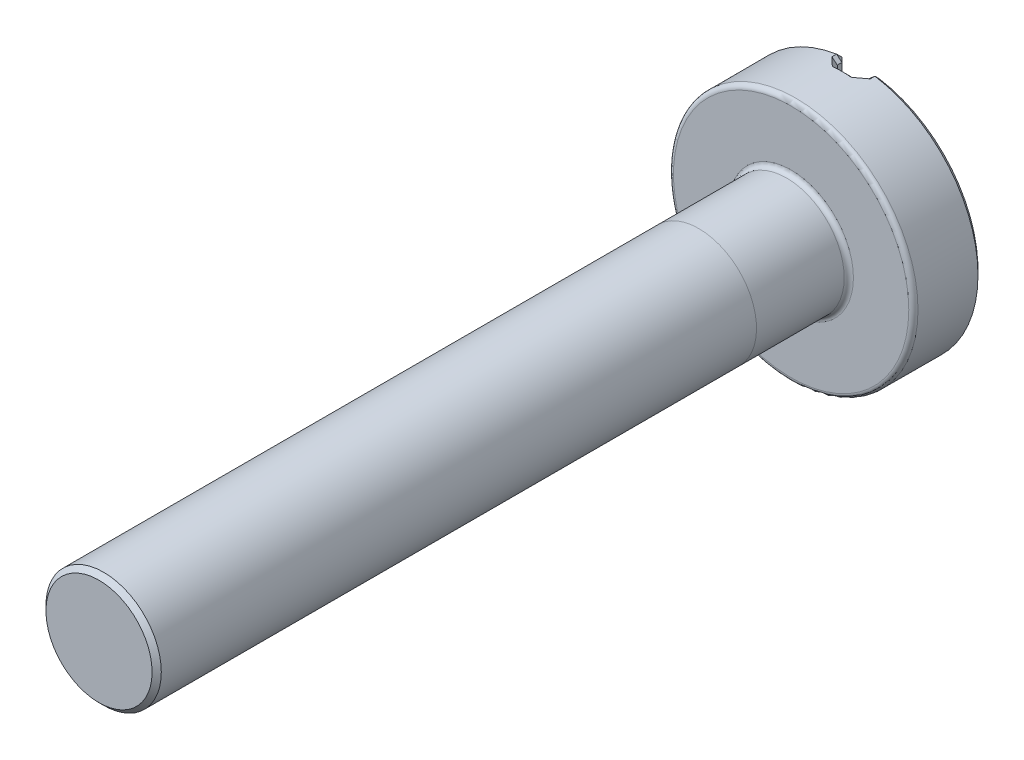
ISO-10303-21;
HEADER;
FILE_DESCRIPTION(('STEP AP214'),'2;1');
FILE_NAME('part.step','',(''),(''),'','','');
FILE_SCHEMA(('AUTOMOTIVE_DESIGN { 1 0 10303 214 1 1 1 1 }'));
ENDSEC;
DATA;
#1=APPLICATION_CONTEXT('core data for automotive mechanical design processes');
#2=APPLICATION_PROTOCOL_DEFINITION('international standard','automotive_design',2000,#1);
#3=PRODUCT_CONTEXT('',#1,'mechanical');
#4=PRODUCT('Part','Part','',(#3));
#5=PRODUCT_RELATED_PRODUCT_CATEGORY('part','',(#4));
#6=PRODUCT_DEFINITION_FORMATION('','',#4);
#7=PRODUCT_DEFINITION_CONTEXT('part definition',#1,'design');
#8=PRODUCT_DEFINITION('design','',#6,#7);
#9=PRODUCT_DEFINITION_SHAPE('','',#8);
#10=(LENGTH_UNIT() NAMED_UNIT(*) SI_UNIT(.MILLI.,.METRE.));
#11=(NAMED_UNIT(*) PLANE_ANGLE_UNIT() SI_UNIT($,.RADIAN.));
#12=(NAMED_UNIT(*) SI_UNIT($,.STERADIAN.) SOLID_ANGLE_UNIT());
#13=UNCERTAINTY_MEASURE_WITH_UNIT(LENGTH_MEASURE(1.E-05),#10,'distance_accuracy_value','');
#14=(GEOMETRIC_REPRESENTATION_CONTEXT(3) GLOBAL_UNCERTAINTY_ASSIGNED_CONTEXT((#13)) GLOBAL_UNIT_ASSIGNED_CONTEXT((#10,
#11,#12)) REPRESENTATION_CONTEXT('',''));
#15=CARTESIAN_POINT('',(0.,0.,0.));
#16=DIRECTION('',(0.,0.,1.));
#17=DIRECTION('',(1.,0.,0.));
#18=AXIS2_PLACEMENT_3D('',#15,#16,#17);
#19=CARTESIAN_POINT('',(0.,0.,7.5));
#20=DIRECTION('',(0.,0.,-1.));
#21=DIRECTION('',(-1.,0.,0.));
#22=AXIS2_PLACEMENT_3D('',#19,#20,#21);
#23=CYLINDRICAL_SURFACE('',#22,0.625);
#24=CARTESIAN_POINT('',(0.,0.,7.45));
#25=DIRECTION('',(0.,0.,1.));
#26=DIRECTION('',(1.,0.,0.));
#27=AXIS2_PLACEMENT_3D('',#24,#25,#26);
#28=CIRCLE('',#27,0.625);
#29=CARTESIAN_POINT('',(0.625,0.,7.45));
#30=VERTEX_POINT('',#29);
#31=EDGE_CURVE('E59',#30,#30,#28,.F.);
#32=ORIENTED_EDGE('',*,*,#31,.T.);
#33=EDGE_LOOP('',(#32));
#34=FACE_BOUND('',#33,.T.);
#35=CARTESIAN_POINT('',(0.,0.,1.));
#36=DIRECTION('',(0.,0.,-1.));
#37=DIRECTION('',(0.,1.,0.));
#38=AXIS2_PLACEMENT_3D('',#35,#36,#37);
#39=CIRCLE('',#38,0.625);
#40=CARTESIAN_POINT('',(0.,0.625,1.));
#41=VERTEX_POINT('',#40);
#42=EDGE_CURVE('E11',#41,#41,#39,.T.);
#43=ORIENTED_EDGE('',*,*,#42,.F.);
#44=EDGE_LOOP('',(#43));
#45=FACE_BOUND('',#44,.T.);
#46=ADVANCED_FACE('F49',(#34,#45),#23,.T.);
#47=CARTESIAN_POINT('',(0.,0.,-0.75));
#48=DIRECTION('',(0.,0.,1.));
#49=DIRECTION('',(1.,0.,0.));
#50=AXIS2_PLACEMENT_3D('',#47,#48,#49);
#51=CYLINDRICAL_SURFACE('',#50,1.325);
#52=CARTESIAN_POINT('',(0.,0.,-0.05));
#53=DIRECTION('',(0.,0.,1.));
#54=DIRECTION('',(1.,0.,0.));
#55=AXIS2_PLACEMENT_3D('',#52,#53,#54);
#56=CIRCLE('',#55,1.325);
#57=CARTESIAN_POINT('',(1.325,0.,-0.05));
#58=VERTEX_POINT('',#57);
#59=EDGE_CURVE('E539',#58,#58,#56,.F.);
#60=ORIENTED_EDGE('',*,*,#59,.T.);
#61=EDGE_LOOP('',(#60));
#62=FACE_BOUND('',#61,.T.);
#63=CARTESIAN_POINT('',(-0.207843137254903,1.30859704657165,-0.650000000000001));
#64=CARTESIAN_POINT('',(-0.198944612952266,1.31001015516288,-0.641083323710144));
#65=CARTESIAN_POINT('',(-0.189997133243153,1.3113383968159,-0.632201765348477));
#66=CARTESIAN_POINT('',(-0.171998203310304,1.31382052719629,-0.614519994761565));
#67=CARTESIAN_POINT('',(-0.162946752754306,1.3149744153663,-0.605719782796444));
#68=CARTESIAN_POINT('',(-0.137386181813813,1.31796203945144,-0.581148582652646));
#69=CARTESIAN_POINT('',(-0.120752529010109,1.31959309958516,-0.565482355604767));
#70=CARTESIAN_POINT('',(-0.103921568627449,1.32091835764895,-0.549999999999999));
#71=B_SPLINE_CURVE_WITH_KNOTS('',3,(#63,#64,#65,#66,#67,#68,#69,#70),.UNSPECIFIED.,.F.,.F.,(4,2,
2,4),(0.,0.0380286734960465,0.0760574685548907,0.144770496492939),.UNSPECIFIED.);
#72=CARTESIAN_POINT('',(-0.207843137254903,1.30859704657165,-0.650000000000001));
#73=VERTEX_POINT('',#72);
#74=CARTESIAN_POINT('',(-0.103921568627449,1.32091835764895,-0.549999999999999));
#75=VERTEX_POINT('',#74);
#76=EDGE_CURVE('E281',#73,#75,#71,.T.);
#77=ORIENTED_EDGE('',*,*,#76,.F.);
#78=DIRECTION('',(0.,0.,1.));
#79=VECTOR('',#78,1.);
#80=CARTESIAN_POINT('',(-0.207843137254903,1.30859704657165,-0.75));
#81=LINE('',#80,#79);
#82=CARTESIAN_POINT('',(-0.207843137254903,1.30859704657165,-0.699999999999998));
#83=VERTEX_POINT('',#82);
#84=EDGE_CURVE('E278',#73,#83,#81,.F.);
#85=ORIENTED_EDGE('',*,*,#84,.T.);
#86=CARTESIAN_POINT('',(0.,0.,-0.699999999999998));
#87=DIRECTION('',(0.,0.,1.));
#88=DIRECTION('',(1.,0.,0.));
#89=AXIS2_PLACEMENT_3D('',#86,#87,#88);
#90=CIRCLE('',#89,1.325);
#91=CARTESIAN_POINT('',(-0.207843137254903,-1.30859704657165,-0.699999999999998));
#92=VERTEX_POINT('',#91);
#93=EDGE_CURVE('E272',#83,#92,#90,.T.);
#94=ORIENTED_EDGE('',*,*,#93,.T.);
#95=DIRECTION('',(0.,0.,1.));
#96=VECTOR('',#95,1.);
#97=CARTESIAN_POINT('',(-0.207843137254903,-1.30859704657165,-0.75));
#98=LINE('',#97,#96);
#99=CARTESIAN_POINT('',(-0.207843137254903,-1.30859704657165,-0.650000000000001));
#100=VERTEX_POINT('',#99);
#101=EDGE_CURVE('E159',#92,#100,#98,.T.);
#102=ORIENTED_EDGE('',*,*,#101,.T.);
#103=CARTESIAN_POINT('',(-0.10392156862745,-1.32091835764895,-0.549999999999999));
#104=CARTESIAN_POINT('',(-0.113236467272082,-1.3201852676791,-0.558567275963699));
#105=CARTESIAN_POINT('',(-0.122490767260579,-1.31935825110937,-0.567191695644924));
#106=CARTESIAN_POINT('',(-0.140884473864295,-1.31752124601971,-0.584542919242578));
#107=CARTESIAN_POINT('',(-0.150023881068516,-1.3165112584382,-0.593269722633688));
#108=CARTESIAN_POINT('',(-0.17552459729029,-1.31342642300711,-0.617891690895517));
#109=CARTESIAN_POINT('',(-0.191763051988927,-1.31114990369223,-0.633889412681227));
#110=CARTESIAN_POINT('',(-0.207843137254903,-1.30859704657165,-0.650000000000001));
#111=B_SPLINE_CURVE_WITH_KNOTS('',3,(#103,#104,#105,#106,#107,#108,#109,#110),.UNSPECIFIED.,.F.,
.F.,(4,2,2,4),(0.,0.0380291626217555,0.076058130205947,0.144770913983086),.UNSPECIFIED.);
#112=CARTESIAN_POINT('',(-0.10392156862745,-1.32091835764895,-0.549999999999999));
#113=VERTEX_POINT('',#112);
#114=EDGE_CURVE('E262',#113,#100,#111,.T.);
#115=ORIENTED_EDGE('',*,*,#114,.F.);
#116=CARTESIAN_POINT('',(0.,0.,-0.549999999999999));
#117=DIRECTION('',(0.,0.,-1.));
#118=DIRECTION('',(-1.,0.,0.));
#119=AXIS2_PLACEMENT_3D('',#116,#117,#118);
#120=CIRCLE('',#119,1.325);
#121=CARTESIAN_POINT('',(0.103921568627449,-1.32091835764895,-0.549999999999999));
#122=VERTEX_POINT('',#121);
#123=EDGE_CURVE('E217',#113,#122,#120,.F.);
#124=ORIENTED_EDGE('',*,*,#123,.T.);
#125=CARTESIAN_POINT('',(0.207843137254903,-1.30859704657165,-0.650000000000001));
#126=CARTESIAN_POINT('',(0.198944612952267,-1.31001015516288,-0.641083323710144));
#127=CARTESIAN_POINT('',(0.189997133243153,-1.3113383968159,-0.632201765348477));
#128=CARTESIAN_POINT('',(0.171998203310304,-1.31382052719629,-0.614519994761565));
#129=CARTESIAN_POINT('',(0.162946752754305,-1.3149744153663,-0.605719782796444));
#130=CARTESIAN_POINT('',(0.137386181813813,-1.31796203945144,-0.581148582652646));
#131=CARTESIAN_POINT('',(0.120752529010108,-1.31959309958516,-0.565482355604768));
#132=CARTESIAN_POINT('',(0.103921568627449,-1.32091835764895,-0.549999999999999));
#133=B_SPLINE_CURVE_WITH_KNOTS('',3,(#125,#126,#127,#128,#129,#130,#131,#132),.UNSPECIFIED.,.F.,
.F.,(4,2,2,4),(0.,0.0380286734960465,0.0760574685548907,0.144770496492939),.UNSPECIFIED.);
#134=CARTESIAN_POINT('',(0.207843137254903,-1.30859704657165,-0.650000000000001));
#135=VERTEX_POINT('',#134);
#136=EDGE_CURVE('E207',#135,#122,#133,.T.);
#137=ORIENTED_EDGE('',*,*,#136,.F.);
#138=DIRECTION('',(0.,0.,1.));
#139=VECTOR('',#138,1.);
#140=CARTESIAN_POINT('',(0.207843137254903,-1.30859704657165,-0.75));
#141=LINE('',#140,#139);
#142=CARTESIAN_POINT('',(0.207843137254903,-1.30859704657165,-0.699999999999998));
#143=VERTEX_POINT('',#142);
#144=EDGE_CURVE('E204',#135,#143,#141,.F.);
#145=ORIENTED_EDGE('',*,*,#144,.T.);
#146=CARTESIAN_POINT('',(0.,0.,-0.699999999999998));
#147=DIRECTION('',(0.,0.,1.));
#148=DIRECTION('',(1.,0.,0.));
#149=AXIS2_PLACEMENT_3D('',#146,#147,#148);
#150=CIRCLE('',#149,1.325);
#151=CARTESIAN_POINT('',(0.207843137254903,1.30859704657165,-0.699999999999998));
#152=VERTEX_POINT('',#151);
#153=EDGE_CURVE('E195',#143,#152,#150,.T.);
#154=ORIENTED_EDGE('',*,*,#153,.T.);
#155=DIRECTION('',(0.,0.,1.));
#156=VECTOR('',#155,1.);
#157=CARTESIAN_POINT('',(0.207843137254903,1.30859704657165,-0.75));
#158=LINE('',#157,#156);
#159=CARTESIAN_POINT('',(0.207843137254903,1.30859704657165,-0.650000000000001));
#160=VERTEX_POINT('',#159);
#161=EDGE_CURVE('E201',#152,#160,#158,.T.);
#162=ORIENTED_EDGE('',*,*,#161,.T.);
#163=CARTESIAN_POINT('',(0.10392156862745,1.32091835764895,-0.549999999999999));
#164=CARTESIAN_POINT('',(0.113236467272082,1.3201852676791,-0.558567275963698));
#165=CARTESIAN_POINT('',(0.122490767260579,1.31935825110937,-0.567191695644924));
#166=CARTESIAN_POINT('',(0.140884473864295,1.31752124601971,-0.584542919242578));
#167=CARTESIAN_POINT('',(0.150023881068516,1.3165112584382,-0.593269722633687));
#168=CARTESIAN_POINT('',(0.17552459729029,1.31342642300711,-0.617891690895517));
#169=CARTESIAN_POINT('',(0.191763051988927,1.31114990369223,-0.633889412681227));
#170=CARTESIAN_POINT('',(0.207843137254903,1.30859704657165,-0.650000000000001));
#171=B_SPLINE_CURVE_WITH_KNOTS('',3,(#163,#164,#165,#166,#167,#168,#169,#170),.UNSPECIFIED.,.F.,
.F.,(4,2,2,4),(0.,0.0380291626217554,0.0760581302059466,0.144770913983086),.UNSPECIFIED.);
#172=CARTESIAN_POINT('',(0.10392156862745,1.32091835764895,-0.549999999999999));
#173=VERTEX_POINT('',#172);
#174=EDGE_CURVE('E254',#173,#160,#171,.T.);
#175=ORIENTED_EDGE('',*,*,#174,.F.);
#176=CARTESIAN_POINT('',(0.,0.,-0.549999999999999));
#177=DIRECTION('',(0.,0.,-1.));
#178=DIRECTION('',(-1.,0.,0.));
#179=AXIS2_PLACEMENT_3D('',#176,#177,#178);
#180=CIRCLE('',#179,1.325);
#181=EDGE_CURVE('E275',#173,#75,#180,.F.);
#182=ORIENTED_EDGE('',*,*,#181,.T.);
#183=EDGE_LOOP('',(#77,#85,#94,#102,#115,#124,#137,#145,#154,#162,#175,#182));
#184=FACE_BOUND('',#183,.T.);
#185=ADVANCED_FACE('F219',(#62,#184),#51,.T.);
#186=CARTESIAN_POINT('',(0.,0.,-0.75));
#187=DIRECTION('',(0.,0.,1.));
#188=DIRECTION('',(1.,0.,0.));
#189=AXIS2_PLACEMENT_3D('',#186,#187,#188);
#190=PLANE('',#189);
#191=CARTESIAN_POINT('',(0.,0.,-0.75));
#192=DIRECTION('',(0.,0.,1.));
#193=DIRECTION('',(1.,0.,0.));
#194=AXIS2_PLACEMENT_3D('',#191,#192,#193);
#195=CIRCLE('',#194,1.275);
#196=CARTESIAN_POINT('',(-0.200000000000001,-1.2592160259463,-0.75));
#197=VERTEX_POINT('',#196);
#198=CARTESIAN_POINT('',(-0.200000000000001,1.2592160259463,-0.75));
#199=VERTEX_POINT('',#198);
#200=EDGE_CURVE('E643',#197,#199,#195,.F.);
#201=ORIENTED_EDGE('',*,*,#200,.T.);
#202=DIRECTION('',(0.,-1.,0.));
#203=VECTOR('',#202,1.);
#204=CARTESIAN_POINT('',(-0.200000000000001,0.,-0.75));
#205=LINE('',#204,#203);
#206=EDGE_CURVE('E651',#199,#197,#205,.T.);
#207=ORIENTED_EDGE('',*,*,#206,.T.);
#208=EDGE_LOOP('',(#201,#207));
#209=FACE_BOUND('',#208,.T.);
#210=ADVANCED_FACE('F517',(#209),#190,.F.);
#211=ORIENTED_EDGE('',*,*,#42,.T.);
#212=EDGE_LOOP('',(#211));
#213=FACE_BOUND('',#212,.T.);
#214=CARTESIAN_POINT('',(0.,0.,0.0499999999999997));
#215=DIRECTION('',(0.,0.,1.));
#216=DIRECTION('',(1.,0.,0.));
#217=AXIS2_PLACEMENT_3D('',#214,#215,#216);
#218=CIRCLE('',#217,0.625);
#219=CARTESIAN_POINT('',(0.625,0.,0.0499999999999997));
#220=VERTEX_POINT('',#219);
#221=EDGE_CURVE('E536',#220,#220,#218,.T.);
#222=ORIENTED_EDGE('',*,*,#221,.T.);
#223=EDGE_LOOP('',(#222));
#224=FACE_BOUND('',#223,.T.);
#225=ADVANCED_FACE('F232',(#213,#224),#23,.T.);
#226=CARTESIAN_POINT('',(0.,0.,7.5));
#227=DIRECTION('',(0.,0.,1.));
#228=DIRECTION('',(1.,0.,0.));
#229=AXIS2_PLACEMENT_3D('',#226,#227,#228);
#230=PLANE('',#229);
#231=CARTESIAN_POINT('',(0.,0.,7.5));
#232=DIRECTION('',(0.,0.,1.));
#233=DIRECTION('',(1.,0.,0.));
#234=AXIS2_PLACEMENT_3D('',#231,#232,#233);
#235=CIRCLE('',#234,0.574999999999999);
#236=CARTESIAN_POINT('',(0.574999999999999,0.,7.5));
#237=VERTEX_POINT('',#236);
#238=EDGE_CURVE('E538',#237,#237,#235,.T.);
#239=ORIENTED_EDGE('',*,*,#238,.T.);
#240=EDGE_LOOP('',(#239));
#241=FACE_BOUND('',#240,.T.);
#242=ADVANCED_FACE('F522',(#241),#230,.T.);
#243=CARTESIAN_POINT('',(0.,0.,-0.75));
#244=DIRECTION('',(0.,0.,1.));
#245=DIRECTION('',(1.,0.,0.));
#246=AXIS2_PLACEMENT_3D('',#243,#244,#245);
#247=CIRCLE('',#246,1.275);
#248=CARTESIAN_POINT('',(0.200000000000001,1.2592160259463,-0.75));
#249=VERTEX_POINT('',#248);
#250=CARTESIAN_POINT('',(0.200000000000001,-1.2592160259463,-0.75));
#251=VERTEX_POINT('',#250);
#252=EDGE_CURVE('E65',#249,#251,#247,.F.);
#253=ORIENTED_EDGE('',*,*,#252,.T.);
#254=DIRECTION('',(0.,1.,0.));
#255=VECTOR('',#254,1.);
#256=CARTESIAN_POINT('',(0.200000000000001,0.,-0.75));
#257=LINE('',#256,#255);
#258=EDGE_CURVE('E563',#251,#249,#257,.T.);
#259=ORIENTED_EDGE('',*,*,#258,.T.);
#260=EDGE_LOOP('',(#253,#259));
#261=FACE_BOUND('',#260,.T.);
#262=ADVANCED_FACE('F528',(#261),#190,.F.);
#263=CARTESIAN_POINT('',(0.,0.,0.));
#264=DIRECTION('',(0.,0.,1.));
#265=DIRECTION('',(1.,0.,0.));
#266=AXIS2_PLACEMENT_3D('',#263,#264,#265);
#267=PLANE('',#266);
#268=CARTESIAN_POINT('',(0.,0.,0.));
#269=DIRECTION('',(0.,0.,1.));
#270=DIRECTION('',(1.,0.,0.));
#271=AXIS2_PLACEMENT_3D('',#268,#269,#270);
#272=CIRCLE('',#271,1.275);
#273=CARTESIAN_POINT('',(1.275,0.,0.));
#274=VERTEX_POINT('',#273);
#275=EDGE_CURVE('E546',#274,#274,#272,.T.);
#276=ORIENTED_EDGE('',*,*,#275,.T.);
#277=EDGE_LOOP('',(#276));
#278=FACE_BOUND('',#277,.T.);
#279=CARTESIAN_POINT('',(0.,0.,0.));
#280=DIRECTION('',(0.,0.,1.));
#281=DIRECTION('',(1.,0.,0.));
#282=AXIS2_PLACEMENT_3D('',#279,#280,#281);
#283=CIRCLE('',#282,0.675);
#284=CARTESIAN_POINT('',(0.675,0.,0.));
#285=VERTEX_POINT('',#284);
#286=EDGE_CURVE('E559',#285,#285,#283,.F.);
#287=ORIENTED_EDGE('',*,*,#286,.T.);
#288=EDGE_LOOP('',(#287));
#289=FACE_BOUND('',#288,.T.);
#290=ADVANCED_FACE('F788',(#278,#289),#267,.T.);
#291=CARTESIAN_POINT('',(-0.149999999999999,4.57974091684262,-0.6));
#292=DIRECTION('',(-1.,0.,0.));
#293=DIRECTION('',(0.,-1.,0.));
#294=AXIS2_PLACEMENT_3D('',#291,#292,#293);
#295=PLANE('',#294);
#296=DIRECTION('',(0.,0.,1.));
#297=VECTOR('',#296,1.);
#298=CARTESIAN_POINT('',(-0.15,1.2592160259463,-0.6));
#299=LINE('',#298,#297);
#300=CARTESIAN_POINT('',(-0.15,1.2592160259463,-0.699999999999998));
#301=VERTEX_POINT('',#300);
#302=CARTESIAN_POINT('',(-0.15,1.2592160259463,-0.650000000000001));
#303=VERTEX_POINT('',#302);
#304=EDGE_CURVE('E184',#301,#303,#299,.T.);
#305=ORIENTED_EDGE('',*,*,#304,.T.);
#306=DIRECTION('',(0.,-1.,0.));
#307=VECTOR('',#306,1.);
#308=CARTESIAN_POINT('',(-0.149999999999999,4.57974091684262,-0.650000000000001));
#309=LINE('',#308,#307);
#310=CARTESIAN_POINT('',(-0.15,-1.2592160259463,-0.650000000000001));
#311=VERTEX_POINT('',#310);
#312=EDGE_CURVE('E189',#303,#311,#309,.T.);
#313=ORIENTED_EDGE('',*,*,#312,.T.);
#314=DIRECTION('',(0.,0.,-1.));
#315=VECTOR('',#314,1.);
#316=CARTESIAN_POINT('',(-0.15,-1.2592160259463,-0.75));
#317=LINE('',#316,#315);
#318=CARTESIAN_POINT('',(-0.15,-1.2592160259463,-0.699999999999998));
#319=VERTEX_POINT('',#318);
#320=EDGE_CURVE('E157',#311,#319,#317,.T.);
#321=ORIENTED_EDGE('',*,*,#320,.T.);
#322=DIRECTION('',(0.,1.,0.));
#323=VECTOR('',#322,1.);
#324=CARTESIAN_POINT('',(-0.149999999999999,4.57974091684262,-0.699999999999998));
#325=LINE('',#324,#323);
#326=EDGE_CURVE('E177',#319,#301,#325,.T.);
#327=ORIENTED_EDGE('',*,*,#326,.T.);
#328=EDGE_LOOP('',(#305,#313,#321,#327));
#329=FACE_BOUND('',#328,.T.);
#330=ADVANCED_FACE('F187',(#329),#295,.F.);
#331=CARTESIAN_POINT('',(0.15,4.57974091684262,-0.6));
#332=DIRECTION('',(1.,0.,0.));
#333=DIRECTION('',(0.,1.,0.));
#334=AXIS2_PLACEMENT_3D('',#331,#332,#333);
#335=PLANE('',#334);
#336=DIRECTION('',(0.,0.,1.));
#337=VECTOR('',#336,1.);
#338=CARTESIAN_POINT('',(0.15,-1.2592160259463,-0.6));
#339=LINE('',#338,#337);
#340=CARTESIAN_POINT('',(0.15,-1.2592160259463,-0.699999999999998));
#341=VERTEX_POINT('',#340);
#342=CARTESIAN_POINT('',(0.15,-1.2592160259463,-0.650000000000001));
#343=VERTEX_POINT('',#342);
#344=EDGE_CURVE('E594',#341,#343,#339,.T.);
#345=ORIENTED_EDGE('',*,*,#344,.T.);
#346=DIRECTION('',(0.,1.,0.));
#347=VECTOR('',#346,1.);
#348=CARTESIAN_POINT('',(0.15,4.57974091684262,-0.650000000000001));
#349=LINE('',#348,#347);
#350=CARTESIAN_POINT('',(0.15,1.2592160259463,-0.650000000000001));
#351=VERTEX_POINT('',#350);
#352=EDGE_CURVE('E983',#343,#351,#349,.T.);
#353=ORIENTED_EDGE('',*,*,#352,.T.);
#354=DIRECTION('',(0.,0.,-1.));
#355=VECTOR('',#354,1.);
#356=CARTESIAN_POINT('',(0.15,1.2592160259463,-0.75));
#357=LINE('',#356,#355);
#358=CARTESIAN_POINT('',(0.15,1.2592160259463,-0.699999999999998));
#359=VERTEX_POINT('',#358);
#360=EDGE_CURVE('E987',#351,#359,#357,.T.);
#361=ORIENTED_EDGE('',*,*,#360,.T.);
#362=DIRECTION('',(0.,-1.,0.));
#363=VECTOR('',#362,1.);
#364=CARTESIAN_POINT('',(0.15,4.57974091684262,-0.699999999999998));
#365=LINE('',#364,#363);
#366=EDGE_CURVE('E289',#359,#341,#365,.T.);
#367=ORIENTED_EDGE('',*,*,#366,.T.);
#368=EDGE_LOOP('',(#345,#353,#361,#367));
#369=FACE_BOUND('',#368,.T.);
#370=ADVANCED_FACE('F774',(#369),#335,.F.);
#371=CARTESIAN_POINT('',(0.,0.,-0.6));
#372=DIRECTION('',(0.,0.,-1.));
#373=DIRECTION('',(-1.,0.,0.));
#374=AXIS2_PLACEMENT_3D('',#371,#372,#373);
#375=PLANE('',#374);
#376=DIRECTION('',(0.,-1.,0.));
#377=VECTOR('',#376,1.);
#378=CARTESIAN_POINT('',(0.0999999999999985,0.,-0.6));
#379=LINE('',#378,#377);
#380=CARTESIAN_POINT('',(0.0999999999999987,1.27107238188861,-0.6));
#381=VERTEX_POINT('',#380);
#382=CARTESIAN_POINT('',(0.0999999999999984,-1.27107238188861,-0.6));
#383=VERTEX_POINT('',#382);
#384=EDGE_CURVE('E637',#381,#383,#379,.T.);
#385=ORIENTED_EDGE('',*,*,#384,.T.);
#386=CARTESIAN_POINT('',(0.,0.,-0.6));
#387=DIRECTION('',(0.,0.,-1.));
#388=DIRECTION('',(-1.,0.,0.));
#389=AXIS2_PLACEMENT_3D('',#386,#387,#388);
#390=CIRCLE('',#389,1.275);
#391=CARTESIAN_POINT('',(-0.0999999999999987,-1.27107238188861,-0.6));
#392=VERTEX_POINT('',#391);
#393=EDGE_CURVE('E609',#383,#392,#390,.T.);
#394=ORIENTED_EDGE('',*,*,#393,.T.);
#395=DIRECTION('',(0.,1.,0.));
#396=VECTOR('',#395,1.);
#397=CARTESIAN_POINT('',(-0.0999999999999986,0.,-0.6));
#398=LINE('',#397,#396);
#399=CARTESIAN_POINT('',(-0.0999999999999984,1.27107238188861,-0.6));
#400=VERTEX_POINT('',#399);
#401=EDGE_CURVE('E645',#392,#400,#398,.T.);
#402=ORIENTED_EDGE('',*,*,#401,.T.);
#403=CARTESIAN_POINT('',(0.,0.,-0.6));
#404=DIRECTION('',(0.,0.,-1.));
#405=DIRECTION('',(-1.,0.,0.));
#406=AXIS2_PLACEMENT_3D('',#403,#404,#405);
#407=CIRCLE('',#406,1.275);
#408=EDGE_CURVE('E634',#400,#381,#407,.T.);
#409=ORIENTED_EDGE('',*,*,#408,.T.);
#410=EDGE_LOOP('',(#385,#394,#402,#409));
#411=FACE_BOUND('',#410,.T.);
#412=ADVANCED_FACE('F499',(#411),#375,.T.);
#413=CARTESIAN_POINT('',(0.15,1.2592160259463,-0.699999999999998));
#414=DIRECTION('',(-0.544565628862059,0.637884434458268,-0.544565628862055));
#415=DIRECTION('',(-0.760546758949787,-0.649283164305817,0.));
#416=AXIS2_PLACEMENT_3D('',#413,#414,#415);
#417=PLANE('',#416);
#418=DIRECTION('',(0.760546758949788,0.649283164305816,0.));
#419=VECTOR('',#418,1.);
#420=CARTESIAN_POINT('',(0.15,1.2592160259463,-0.699999999999998));
#421=LINE('',#420,#419);
#422=EDGE_CURVE('E570',#152,#359,#421,.F.);
#423=ORIENTED_EDGE('',*,*,#422,.F.);
#424=DIRECTION('',(-0.110918710774361,-0.698353090921881,-0.707106781186554));
#425=VECTOR('',#424,1.);
#426=CARTESIAN_POINT('',(0.,0.,-2.02500000000002));
#427=LINE('',#426,#425);
#428=EDGE_CURVE('E185',#249,#152,#427,.F.);
#429=ORIENTED_EDGE('',*,*,#428,.F.);
#430=DIRECTION('',(0.707106781186541,0.,-0.707106781186554));
#431=VECTOR('',#430,1.);
#432=CARTESIAN_POINT('',(0.15,1.2592160259463,-0.699999999999998));
#433=LINE('',#432,#431);
#434=EDGE_CURVE('E566',#359,#249,#433,.T.);
#435=ORIENTED_EDGE('',*,*,#434,.F.);
#436=EDGE_LOOP('',(#423,#429,#435));
#437=FACE_BOUND('',#436,.T.);
#438=ADVANCED_FACE('F494',(#437),#417,.T.);
#439=CARTESIAN_POINT('',(0.,0.,-0.699999999999998));
#440=DIRECTION('',(0.,0.,1.));
#441=DIRECTION('',(1.,0.,0.));
#442=AXIS2_PLACEMENT_3D('',#439,#440,#441);
#443=CONICAL_SURFACE('',#442,1.325,0.78539816339744);
#444=ORIENTED_EDGE('',*,*,#428,.T.);
#445=ORIENTED_EDGE('',*,*,#153,.F.);
#446=DIRECTION('',(0.110918710774354,-0.698353090921882,0.707106781186554));
#447=VECTOR('',#446,1.);
#448=CARTESIAN_POINT('',(0.,0.,-2.02500000000002));
#449=LINE('',#448,#447);
#450=EDGE_CURVE('E574',#251,#143,#449,.T.);
#451=ORIENTED_EDGE('',*,*,#450,.F.);
#452=ORIENTED_EDGE('',*,*,#252,.F.);
#453=EDGE_LOOP('',(#444,#445,#451,#452));
#454=FACE_BOUND('',#453,.T.);
#455=ADVANCED_FACE('F488',(#454),#443,.T.);
#456=CARTESIAN_POINT('',(0.200000000000001,0.,-0.75));
#457=DIRECTION('',(0.707106781186553,0.,0.707106781186541));
#458=DIRECTION('',(0.,1.,0.));
#459=AXIS2_PLACEMENT_3D('',#456,#457,#458);
#460=PLANE('',#459);
#461=ORIENTED_EDGE('',*,*,#434,.T.);
#462=ORIENTED_EDGE('',*,*,#258,.F.);
#463=DIRECTION('',(-0.707106781186541,0.,0.707106781186554));
#464=VECTOR('',#463,1.);
#465=CARTESIAN_POINT('',(0.178921568627451,-1.2592160259463,-0.72892156862745));
#466=LINE('',#465,#464);
#467=EDGE_CURVE('E578',#341,#251,#466,.F.);
#468=ORIENTED_EDGE('',*,*,#467,.F.);
#469=ORIENTED_EDGE('',*,*,#366,.F.);
#470=EDGE_LOOP('',(#461,#462,#468,#469));
#471=FACE_BOUND('',#470,.T.);
#472=ADVANCED_FACE('F481',(#471),#460,.F.);
#473=CARTESIAN_POINT('',(0.15,1.2592160259463,-0.75));
#474=DIRECTION('',(-0.649283164305816,0.760546758949788,0.));
#475=DIRECTION('',(0.,0.,1.));
#476=AXIS2_PLACEMENT_3D('',#473,#474,#475);
#477=PLANE('',#476);
#478=ORIENTED_EDGE('',*,*,#422,.T.);
#479=ORIENTED_EDGE('',*,*,#360,.F.);
#480=DIRECTION('',(-0.760546758949788,-0.649283164305816,0.));
#481=VECTOR('',#480,1.);
#482=CARTESIAN_POINT('',(0.207843137254903,1.30859704657165,-0.650000000000001));
#483=LINE('',#482,#481);
#484=EDGE_CURVE('E581',#160,#351,#483,.T.);
#485=ORIENTED_EDGE('',*,*,#484,.F.);
#486=ORIENTED_EDGE('',*,*,#161,.F.);
#487=EDGE_LOOP('',(#478,#479,#485,#486));
#488=FACE_BOUND('',#487,.T.);
#489=ADVANCED_FACE('F474',(#488),#477,.T.);
#490=CARTESIAN_POINT('',(0.207843137254903,-1.30859704657165,-0.699999999999998));
#491=DIRECTION('',(-0.544565628862068,-0.637884434458262,-0.544565628862053));
#492=DIRECTION('',(0.760546758949778,-0.649283164305828,0.));
#493=AXIS2_PLACEMENT_3D('',#490,#491,#492);
#494=PLANE('',#493);
#495=ORIENTED_EDGE('',*,*,#467,.T.);
#496=ORIENTED_EDGE('',*,*,#450,.T.);
#497=DIRECTION('',(0.760546758949778,-0.649283164305828,0.));
#498=VECTOR('',#497,1.);
#499=CARTESIAN_POINT('',(0.207843137254903,-1.30859704657165,-0.699999999999998));
#500=LINE('',#499,#498);
#501=EDGE_CURVE('E429',#341,#143,#500,.T.);
#502=ORIENTED_EDGE('',*,*,#501,.F.);
#503=EDGE_LOOP('',(#495,#496,#502));
#504=FACE_BOUND('',#503,.T.);
#505=ADVANCED_FACE('F462',(#504),#494,.T.);
#506=CARTESIAN_POINT('',(0.0999999999999987,1.27107238188861,-0.6));
#507=CARTESIAN_POINT('',(0.15,1.2592160259463,-0.650000000000001));
#508=CARTESIAN_POINT('',(0.10392156862745,1.32091835764895,-0.549999999999999));
#509=CARTESIAN_POINT('',(0.207843137254903,1.30859704657165,-0.650000000000001));
#510=CARTESIAN_POINT('',(0.104024025887025,1.32222066357865,-0.54869366994042));
#511=CARTESIAN_POINT('',(0.209354381833633,1.30988720480396,-0.650000000000001));
#512=B_SPLINE_SURFACE_WITH_KNOTS('',1,1,((#506,#507),(#508,#509),(#510,#511)),.UNSPECIFIED.,.F.,
.F.,.F.,(2,1,2),(2,2),(0.,1.,1.0261266011916),(0.,1.),.UNSPECIFIED.);
#513=CARTESIAN_POINT('',(0.15,1.2592160259463,-0.650000000000001));
#514=CARTESIAN_POINT('',(0.145580136008863,1.26026409556021,-0.645580136008863));
#515=CARTESIAN_POINT('',(0.141160272017726,1.26131216517412,-0.641160272017726));
#516=CARTESIAN_POINT('',(0.132320544035451,1.26340830440194,-0.632320544035452));
#517=CARTESIAN_POINT('',(0.127900680044314,1.26445637401586,-0.627900680044315));
#518=CARTESIAN_POINT('',(0.115653877368784,1.26736042304938,-0.615653877368785));
#519=CARTESIAN_POINT('',(0.107826938684391,1.269216402469,-0.607826938684393));
#520=CARTESIAN_POINT('',(0.0999999999999987,1.27107238188861,-0.6));
#521=B_SPLINE_CURVE_WITH_KNOTS('',3,(#513,#514,#515,#516,#517,#518,#519,#520),.UNSPECIFIED.,.F.,
.F.,(4,2,2,4),(0.,0.0190136689737449,0.0380273379474899,0.0716977905951851),.UNSPECIFIED.);
#522=EDGE_CURVE('E419',#381,#351,#521,.F.);
#523=DIRECTION('',(0.05545935538718,0.704928549499911,0.70710678118654));
#524=VECTOR('',#523,1.);
#525=CARTESIAN_POINT('',(0.0999999999999987,1.27107238188861,-0.6));
#526=LINE('',#525,#524);
#527=EDGE_CURVE('E430',#173,#381,#526,.F.);
#528=ORIENTED_EDGE('',*,*,#174,.T.);
#529=ORIENTED_EDGE('',*,*,#484,.T.);
#530=ORIENTED_EDGE('',*,*,#522,.F.);
#531=ORIENTED_EDGE('',*,*,#527,.F.);
#532=EDGE_LOOP('',(#528,#529,#530,#531));
#533=FACE_BOUND('',#532,.T.);
#534=ADVANCED_FACE('F453',(#533),#512,.T.);
#535=CARTESIAN_POINT('',(0.15,-1.2592160259463,-0.75));
#536=DIRECTION('',(0.649283164305828,0.760546758949778,0.));
#537=DIRECTION('',(0.,0.,1.));
#538=AXIS2_PLACEMENT_3D('',#535,#536,#537);
#539=PLANE('',#538);
#540=ORIENTED_EDGE('',*,*,#501,.T.);
#541=ORIENTED_EDGE('',*,*,#144,.F.);
#542=DIRECTION('',(0.760546758949778,-0.649283164305828,0.));
#543=VECTOR('',#542,1.);
#544=CARTESIAN_POINT('',(0.15,-1.2592160259463,-0.650000000000001));
#545=LINE('',#544,#543);
#546=EDGE_CURVE('E605',#343,#135,#545,.T.);
#547=ORIENTED_EDGE('',*,*,#546,.F.);
#548=ORIENTED_EDGE('',*,*,#344,.F.);
#549=EDGE_LOOP('',(#540,#541,#547,#548));
#550=FACE_BOUND('',#549,.T.);
#551=ADVANCED_FACE('F403',(#550),#539,.F.);
#552=CARTESIAN_POINT('',(0.0999999999999985,0.,-0.6));
#553=DIRECTION('',(0.707106781186541,0.,0.707106781186554));
#554=DIRECTION('',(0.,-1.,0.));
#555=AXIS2_PLACEMENT_3D('',#552,#553,#554);
#556=PLANE('',#555);
#557=ORIENTED_EDGE('',*,*,#522,.T.);
#558=ORIENTED_EDGE('',*,*,#352,.F.);
#559=CARTESIAN_POINT('',(0.0999999999999984,-1.27107238188861,-0.6));
#560=CARTESIAN_POINT('',(0.104419863991136,-1.2700243122747,-0.604419863991137));
#561=CARTESIAN_POINT('',(0.108839727982273,-1.26897624266079,-0.608839727982274));
#562=CARTESIAN_POINT('',(0.117679455964547,-1.26688010343297,-0.617679455964549));
#563=CARTESIAN_POINT('',(0.122099319955685,-1.26583203381906,-0.622099319955686));
#564=CARTESIAN_POINT('',(0.134346122631215,-1.26292798478553,-0.634346122631216));
#565=CARTESIAN_POINT('',(0.142173061315607,-1.26107200536592,-0.642173061315608));
#566=CARTESIAN_POINT('',(0.15,-1.2592160259463,-0.650000000000001));
#567=B_SPLINE_CURVE_WITH_KNOTS('',3,(#559,#560,#561,#562,#563,#564,#565,#566),.UNSPECIFIED.,.F.,
.F.,(4,2,2,4),(0.,0.019013668973745,0.0380273379474899,0.0716977905951853),.UNSPECIFIED.);
#568=EDGE_CURVE('E411',#383,#343,#567,.T.);
#569=ORIENTED_EDGE('',*,*,#568,.F.);
#570=ORIENTED_EDGE('',*,*,#384,.F.);
#571=EDGE_LOOP('',(#557,#558,#569,#570));
#572=FACE_BOUND('',#571,.T.);
#573=ADVANCED_FACE('F390',(#572),#556,.F.);
#574=CARTESIAN_POINT('',(0.,0.,-0.549999999999999));
#575=DIRECTION('',(0.,0.,1.));
#576=DIRECTION('',(1.,0.,0.));
#577=AXIS2_PLACEMENT_3D('',#574,#575,#576);
#578=CONICAL_SURFACE('',#577,1.325,0.785398163397457);
#579=ORIENTED_EDGE('',*,*,#527,.T.);
#580=ORIENTED_EDGE('',*,*,#408,.F.);
#581=DIRECTION('',(0.05545935538718,-0.704928549499911,-0.70710678118654));
#582=VECTOR('',#581,1.);
#583=CARTESIAN_POINT('',(-0.103921568627449,1.32091835764895,-0.549999999999999));
#584=LINE('',#583,#582);
#585=EDGE_CURVE('E619',#75,#400,#584,.T.);
#586=ORIENTED_EDGE('',*,*,#585,.F.);
#587=ORIENTED_EDGE('',*,*,#181,.F.);
#588=EDGE_LOOP('',(#579,#580,#586,#587));
#589=FACE_BOUND('',#588,.T.);
#590=ADVANCED_FACE('F402',(#589),#578,.T.);
#591=CARTESIAN_POINT('',(-0.15,1.2592160259463,-0.75));
#592=DIRECTION('',(-0.649283164305828,-0.760546758949778,0.));
#593=DIRECTION('',(0.,0.,1.));
#594=AXIS2_PLACEMENT_3D('',#591,#592,#593);
#595=PLANE('',#594);
#596=DIRECTION('',(-0.760546758949778,0.649283164305828,0.));
#597=VECTOR('',#596,1.);
#598=CARTESIAN_POINT('',(-0.207843137254903,1.30859704657165,-0.699999999999998));
#599=LINE('',#598,#597);
#600=EDGE_CURVE('E611',#83,#301,#599,.F.);
#601=ORIENTED_EDGE('',*,*,#600,.F.);
#602=ORIENTED_EDGE('',*,*,#84,.F.);
#603=DIRECTION('',(-0.760546758949778,0.649283164305828,0.));
#604=VECTOR('',#603,1.);
#605=CARTESIAN_POINT('',(-0.15,1.2592160259463,-0.650000000000001));
#606=LINE('',#605,#604);
#607=EDGE_CURVE('E614',#303,#73,#606,.T.);
#608=ORIENTED_EDGE('',*,*,#607,.F.);
#609=ORIENTED_EDGE('',*,*,#304,.F.);
#610=EDGE_LOOP('',(#601,#602,#608,#609));
#611=FACE_BOUND('',#610,.T.);
#612=ADVANCED_FACE('F675',(#611),#595,.F.);
#613=CARTESIAN_POINT('',(0.15,-1.2592160259463,-0.650000000000001));
#614=CARTESIAN_POINT('',(0.0999999999999984,-1.27107238188861,-0.6));
#615=CARTESIAN_POINT('',(0.207843137254903,-1.30859704657165,-0.650000000000001));
#616=CARTESIAN_POINT('',(0.103921568627449,-1.32091835764895,-0.549999999999999));
#617=CARTESIAN_POINT('',(0.209333861546876,-1.30986968651654,-0.650000000000001));
#618=CARTESIAN_POINT('',(0.104022634681143,-1.32220298034491,-0.548711407815412));
#619=B_SPLINE_SURFACE_WITH_KNOTS('',1,1,((#613,#614),(#615,#616),(#617,#618)),.UNSPECIFIED.,.F.,
.F.,.F.,(2,1,2),(2,2),(0.,1.,1.02577184369175),(0.,1.),.UNSPECIFIED.);
#620=DIRECTION('',(-0.05545935538718,0.704928549499911,-0.70710678118654));
#621=VECTOR('',#620,1.);
#622=CARTESIAN_POINT('',(0.103921568627449,-1.32091835764895,-0.549999999999999));
#623=LINE('',#622,#621);
#624=EDGE_CURVE('E348',#383,#122,#623,.F.);
#625=ORIENTED_EDGE('',*,*,#546,.T.);
#626=ORIENTED_EDGE('',*,*,#136,.T.);
#627=ORIENTED_EDGE('',*,*,#624,.F.);
#628=ORIENTED_EDGE('',*,*,#568,.T.);
#629=EDGE_LOOP('',(#625,#626,#627,#628));
#630=FACE_BOUND('',#629,.T.);
#631=ADVANCED_FACE('F388',(#630),#619,.T.);
#632=CARTESIAN_POINT('',(-0.15,1.2592160259463,-0.650000000000001));
#633=CARTESIAN_POINT('',(-0.0999999999999984,1.27107238188861,-0.6));
#634=CARTESIAN_POINT('',(-0.207843137254903,1.30859704657165,-0.650000000000001));
#635=CARTESIAN_POINT('',(-0.103921568627449,1.32091835764895,-0.549999999999999));
#636=CARTESIAN_POINT('',(-0.209333861546877,1.30986968651654,-0.650000000000001));
#637=CARTESIAN_POINT('',(-0.104022634681143,1.32220298034491,-0.548711407815412));
#638=B_SPLINE_SURFACE_WITH_KNOTS('',1,1,((#632,#633),(#634,#635),(#636,#637)),.UNSPECIFIED.,.F.,
.F.,.F.,(2,1,2),(2,2),(0.,1.,1.02577184369175),(0.,1.),.UNSPECIFIED.);
#639=CARTESIAN_POINT('',(-0.0999999999999984,1.27107238188861,-0.6));
#640=CARTESIAN_POINT('',(-0.104419863991136,1.2700243122747,-0.604419863991137));
#641=CARTESIAN_POINT('',(-0.108839727982273,1.26897624266079,-0.608839727982274));
#642=CARTESIAN_POINT('',(-0.117679455964547,1.26688010343297,-0.617679455964549));
#643=CARTESIAN_POINT('',(-0.122099319955685,1.26583203381906,-0.622099319955686));
#644=CARTESIAN_POINT('',(-0.134346122631215,1.26292798478553,-0.634346122631216));
#645=CARTESIAN_POINT('',(-0.142173061315607,1.26107200536592,-0.642173061315608));
#646=CARTESIAN_POINT('',(-0.15,1.2592160259463,-0.650000000000001));
#647=B_SPLINE_CURVE_WITH_KNOTS('',3,(#639,#640,#641,#642,#643,#644,#645,#646),.UNSPECIFIED.,.F.,
.F.,(4,2,2,4),(0.,0.019013668973745,0.0380273379474899,0.0716977905951853),.UNSPECIFIED.);
#648=EDGE_CURVE('E338',#303,#400,#647,.F.);
#649=ORIENTED_EDGE('',*,*,#76,.T.);
#650=ORIENTED_EDGE('',*,*,#585,.T.);
#651=ORIENTED_EDGE('',*,*,#648,.F.);
#652=ORIENTED_EDGE('',*,*,#607,.T.);
#653=EDGE_LOOP('',(#649,#650,#651,#652));
#654=FACE_BOUND('',#653,.T.);
#655=ADVANCED_FACE('F379',(#654),#638,.T.);
#656=CARTESIAN_POINT('',(-0.207843137254903,1.30859704657165,-0.699999999999998));
#657=DIRECTION('',(0.544565628862068,0.637884434458262,-0.544565628862053));
#658=DIRECTION('',(-0.760546758949778,0.649283164305828,0.));
#659=AXIS2_PLACEMENT_3D('',#656,#657,#658);
#660=PLANE('',#659);
#661=DIRECTION('',(-0.110918710774354,0.698353090921882,0.707106781186554));
#662=VECTOR('',#661,1.);
#663=CARTESIAN_POINT('',(0.,0.,-2.02500000000002));
#664=LINE('',#663,#662);
#665=EDGE_CURVE('E666',#83,#199,#664,.F.);
#666=ORIENTED_EDGE('',*,*,#665,.F.);
#667=ORIENTED_EDGE('',*,*,#600,.T.);
#668=DIRECTION('',(0.707106781186541,0.,0.707106781186554));
#669=VECTOR('',#668,1.);
#670=CARTESIAN_POINT('',(-0.178921568627451,1.2592160259463,-0.72892156862745));
#671=LINE('',#670,#669);
#672=EDGE_CURVE('E180',#199,#301,#671,.T.);
#673=ORIENTED_EDGE('',*,*,#672,.F.);
#674=EDGE_LOOP('',(#666,#667,#673));
#675=FACE_BOUND('',#674,.T.);
#676=ADVANCED_FACE('F372',(#675),#660,.T.);
#677=CARTESIAN_POINT('',(0.,0.,-0.549999999999999));
#678=DIRECTION('',(0.,0.,1.));
#679=DIRECTION('',(1.,0.,0.));
#680=AXIS2_PLACEMENT_3D('',#677,#678,#679);
#681=CONICAL_SURFACE('',#680,1.325,0.785398163397457);
#682=ORIENTED_EDGE('',*,*,#624,.T.);
#683=ORIENTED_EDGE('',*,*,#123,.F.);
#684=DIRECTION('',(-0.0554593553871802,-0.704928549499911,0.70710678118654));
#685=VECTOR('',#684,1.);
#686=CARTESIAN_POINT('',(-0.0999999999999987,-1.27107238188861,-0.6));
#687=LINE('',#686,#685);
#688=EDGE_CURVE('E664',#392,#113,#687,.T.);
#689=ORIENTED_EDGE('',*,*,#688,.F.);
#690=ORIENTED_EDGE('',*,*,#393,.F.);
#691=EDGE_LOOP('',(#682,#683,#689,#690));
#692=FACE_BOUND('',#691,.T.);
#693=ADVANCED_FACE('F324',(#692),#681,.T.);
#694=CARTESIAN_POINT('',(-0.0999999999999986,0.,-0.6));
#695=DIRECTION('',(-0.707106781186541,0.,0.707106781186554));
#696=DIRECTION('',(0.,1.,0.));
#697=AXIS2_PLACEMENT_3D('',#694,#695,#696);
#698=PLANE('',#697);
#699=ORIENTED_EDGE('',*,*,#648,.T.);
#700=ORIENTED_EDGE('',*,*,#401,.F.);
#701=CARTESIAN_POINT('',(-0.15,-1.2592160259463,-0.650000000000001));
#702=CARTESIAN_POINT('',(-0.145580136008863,-1.26026409556021,-0.645580136008863));
#703=CARTESIAN_POINT('',(-0.141160272017726,-1.26131216517412,-0.641160272017726));
#704=CARTESIAN_POINT('',(-0.132320544035451,-1.26340830440194,-0.632320544035452));
#705=CARTESIAN_POINT('',(-0.127900680044314,-1.26445637401585,-0.627900680044315));
#706=CARTESIAN_POINT('',(-0.115653877368784,-1.26736042304938,-0.615653877368785));
#707=CARTESIAN_POINT('',(-0.107826938684391,-1.269216402469,-0.607826938684393));
#708=CARTESIAN_POINT('',(-0.0999999999999987,-1.27107238188861,-0.6));
#709=B_SPLINE_CURVE_WITH_KNOTS('',3,(#701,#702,#703,#704,#705,#706,#707,#708),.UNSPECIFIED.,.F.,
.F.,(4,2,2,4),(0.,0.019013668973745,0.03802733794749,0.0716977905951853),.UNSPECIFIED.);
#710=EDGE_CURVE('E174',#311,#392,#709,.T.);
#711=ORIENTED_EDGE('',*,*,#710,.F.);
#712=ORIENTED_EDGE('',*,*,#312,.F.);
#713=EDGE_LOOP('',(#699,#700,#711,#712));
#714=FACE_BOUND('',#713,.T.);
#715=ADVANCED_FACE('F317',(#714),#698,.F.);
#716=CARTESIAN_POINT('',(-0.200000000000001,0.,-0.75));
#717=DIRECTION('',(-0.707106781186554,0.,0.707106781186541));
#718=DIRECTION('',(0.,-1.,0.));
#719=AXIS2_PLACEMENT_3D('',#716,#717,#718);
#720=PLANE('',#719);
#721=ORIENTED_EDGE('',*,*,#672,.T.);
#722=ORIENTED_EDGE('',*,*,#326,.F.);
#723=DIRECTION('',(-0.707106781186541,0.,-0.707106781186554));
#724=VECTOR('',#723,1.);
#725=CARTESIAN_POINT('',(-0.15,-1.2592160259463,-0.699999999999998));
#726=LINE('',#725,#724);
#727=EDGE_CURVE('E165',#197,#319,#726,.F.);
#728=ORIENTED_EDGE('',*,*,#727,.F.);
#729=ORIENTED_EDGE('',*,*,#206,.F.);
#730=EDGE_LOOP('',(#721,#722,#728,#729));
#731=FACE_BOUND('',#730,.T.);
#732=ADVANCED_FACE('F178',(#731),#720,.F.);
#733=CARTESIAN_POINT('',(0.,0.,-0.699999999999998));
#734=DIRECTION('',(0.,0.,1.));
#735=DIRECTION('',(1.,0.,0.));
#736=AXIS2_PLACEMENT_3D('',#733,#734,#735);
#737=CONICAL_SURFACE('',#736,1.325,0.78539816339744);
#738=ORIENTED_EDGE('',*,*,#665,.T.);
#739=ORIENTED_EDGE('',*,*,#200,.F.);
#740=DIRECTION('',(0.110918710774354,0.698353090921882,-0.707106781186554));
#741=VECTOR('',#740,1.);
#742=CARTESIAN_POINT('',(0.,0.,-2.02500000000002));
#743=LINE('',#742,#741);
#744=EDGE_CURVE('E169',#92,#197,#743,.T.);
#745=ORIENTED_EDGE('',*,*,#744,.F.);
#746=ORIENTED_EDGE('',*,*,#93,.F.);
#747=EDGE_LOOP('',(#738,#739,#745,#746));
#748=FACE_BOUND('',#747,.T.);
#749=ADVANCED_FACE('F671',(#748),#737,.T.);
#750=CARTESIAN_POINT('',(-0.0999999999999987,-1.27107238188861,-0.6));
#751=CARTESIAN_POINT('',(-0.15,-1.2592160259463,-0.650000000000001));
#752=CARTESIAN_POINT('',(-0.10392156862745,-1.32091835764895,-0.549999999999999));
#753=CARTESIAN_POINT('',(-0.207843137254903,-1.30859704657165,-0.650000000000001));
#754=CARTESIAN_POINT('',(-0.104024025887025,-1.32222066357865,-0.54869366994042));
#755=CARTESIAN_POINT('',(-0.209354381833633,-1.30988720480396,-0.650000000000001));
#756=B_SPLINE_SURFACE_WITH_KNOTS('',1,1,((#750,#751),(#752,#753),(#754,#755)),.UNSPECIFIED.,.F.,
.F.,.F.,(2,1,2),(2,2),(0.,1.,1.0261266011916),(0.,1.),.UNSPECIFIED.);
#757=DIRECTION('',(0.760546758949778,0.649283164305828,0.));
#758=VECTOR('',#757,1.);
#759=CARTESIAN_POINT('',(-0.207843137254903,-1.30859704657165,-0.650000000000001));
#760=LINE('',#759,#758);
#761=EDGE_CURVE('E162',#311,#100,#760,.F.);
#762=ORIENTED_EDGE('',*,*,#688,.T.);
#763=ORIENTED_EDGE('',*,*,#114,.T.);
#764=ORIENTED_EDGE('',*,*,#761,.F.);
#765=ORIENTED_EDGE('',*,*,#710,.T.);
#766=EDGE_LOOP('',(#762,#763,#764,#765));
#767=FACE_BOUND('',#766,.T.);
#768=ADVANCED_FACE('F316',(#767),#756,.T.);
#769=CARTESIAN_POINT('',(-0.15,-1.2592160259463,-0.699999999999998));
#770=DIRECTION('',(0.544565628862068,-0.637884434458262,-0.544565628862053));
#771=DIRECTION('',(0.760546758949778,0.649283164305828,0.));
#772=AXIS2_PLACEMENT_3D('',#769,#770,#771);
#773=PLANE('',#772);
#774=ORIENTED_EDGE('',*,*,#744,.T.);
#775=ORIENTED_EDGE('',*,*,#727,.T.);
#776=DIRECTION('',(-0.760546758949778,-0.649283164305828,0.));
#777=VECTOR('',#776,1.);
#778=CARTESIAN_POINT('',(-0.15,-1.2592160259463,-0.699999999999998));
#779=LINE('',#778,#777);
#780=EDGE_CURVE('E153',#92,#319,#779,.F.);
#781=ORIENTED_EDGE('',*,*,#780,.F.);
#782=EDGE_LOOP('',(#774,#775,#781));
#783=FACE_BOUND('',#782,.T.);
#784=ADVANCED_FACE('F167',(#783),#773,.T.);
#785=CARTESIAN_POINT('',(-0.15,-1.2592160259463,-0.75));
#786=DIRECTION('',(0.649283164305828,-0.760546758949778,0.));
#787=DIRECTION('',(0.,0.,1.));
#788=AXIS2_PLACEMENT_3D('',#785,#786,#787);
#789=PLANE('',#788);
#790=ORIENTED_EDGE('',*,*,#761,.T.);
#791=ORIENTED_EDGE('',*,*,#101,.F.);
#792=ORIENTED_EDGE('',*,*,#780,.T.);
#793=ORIENTED_EDGE('',*,*,#320,.F.);
#794=EDGE_LOOP('',(#790,#791,#792,#793));
#795=FACE_BOUND('',#794,.T.);
#796=ADVANCED_FACE('F155',(#795),#789,.T.);
#797=CARTESIAN_POINT('',(0.,0.,-0.05));
#798=DIRECTION('',(0.,0.,1.));
#799=DIRECTION('',(1.,0.,0.));
#800=AXIS2_PLACEMENT_3D('',#797,#798,#799);
#801=TOROIDAL_SURFACE('',#800,1.275,0.05);
#802=ORIENTED_EDGE('',*,*,#59,.F.);
#803=EDGE_LOOP('',(#802));
#804=FACE_BOUND('',#803,.T.);
#805=ORIENTED_EDGE('',*,*,#275,.F.);
#806=EDGE_LOOP('',(#805));
#807=FACE_BOUND('',#806,.T.);
#808=ADVANCED_FACE('F310',(#804,#807),#801,.T.);
#809=CARTESIAN_POINT('',(0.,0.,0.0499999999999997));
#810=DIRECTION('',(0.,0.,1.));
#811=DIRECTION('',(1.,0.,0.));
#812=AXIS2_PLACEMENT_3D('',#809,#810,#811);
#813=TOROIDAL_SURFACE('',#812,0.675,0.05);
#814=ORIENTED_EDGE('',*,*,#286,.F.);
#815=EDGE_LOOP('',(#814));
#816=FACE_BOUND('',#815,.T.);
#817=ORIENTED_EDGE('',*,*,#221,.F.);
#818=EDGE_LOOP('',(#817));
#819=FACE_BOUND('',#818,.T.);
#820=ADVANCED_FACE('F502',(#816,#819),#813,.F.);
#821=CARTESIAN_POINT('',(0.,0.,7.5));
#822=DIRECTION('',(0.,0.,-1.));
#823=DIRECTION('',(-1.,0.,0.));
#824=AXIS2_PLACEMENT_3D('',#821,#822,#823);
#825=CONICAL_SURFACE('',#824,0.574999999999999,0.785398163397451);
#826=ORIENTED_EDGE('',*,*,#31,.F.);
#827=EDGE_LOOP('',(#826));
#828=FACE_BOUND('',#827,.T.);
#829=ORIENTED_EDGE('',*,*,#238,.F.);
#830=EDGE_LOOP('',(#829));
#831=FACE_BOUND('',#830,.T.);
#832=ADVANCED_FACE('F52',(#828,#831),#825,.T.);
#833=CLOSED_SHELL('',(#46,#185,#210,#225,#242,#262,#290,#330,#370,#412,#438,#455,#472,#489,#505,
#534,#551,#573,#590,#612,#631,#655,#676,#693,#715,#732,#749,#768,#784,#796,#808,#820,#832));
#834=MANIFOLD_SOLID_BREP('B2',#833);
#835=ADVANCED_BREP_SHAPE_REPRESENTATION('',(#18,#834),#14);
#836=SHAPE_DEFINITION_REPRESENTATION(#9,#835);
ENDSEC;
END-ISO-10303-21;
